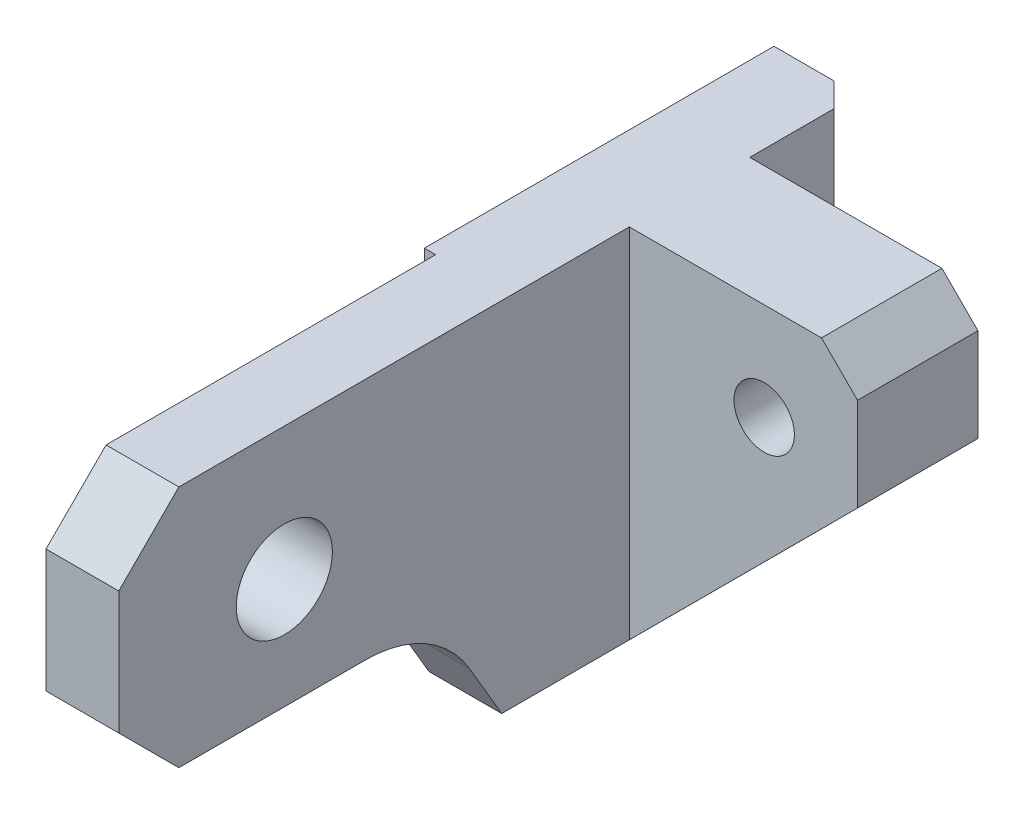
ISO-10303-21;
HEADER;
FILE_DESCRIPTION(('STEP AP214'),'2;1');
FILE_NAME('part.step','',(''),(''),'','','');
FILE_SCHEMA(('AUTOMOTIVE_DESIGN { 1 0 10303 214 1 1 1 1 }'));
ENDSEC;
DATA;
#1=APPLICATION_CONTEXT('core data for automotive mechanical design processes');
#2=APPLICATION_PROTOCOL_DEFINITION('international standard','automotive_design',2000,#1);
#3=PRODUCT_CONTEXT('',#1,'mechanical');
#4=PRODUCT('Part','Part','',(#3));
#5=PRODUCT_RELATED_PRODUCT_CATEGORY('part','',(#4));
#6=PRODUCT_DEFINITION_FORMATION('','',#4);
#7=PRODUCT_DEFINITION_CONTEXT('part definition',#1,'design');
#8=PRODUCT_DEFINITION('design','',#6,#7);
#9=PRODUCT_DEFINITION_SHAPE('','',#8);
#10=(LENGTH_UNIT() NAMED_UNIT(*) SI_UNIT(.MILLI.,.METRE.));
#11=(NAMED_UNIT(*) PLANE_ANGLE_UNIT() SI_UNIT($,.RADIAN.));
#12=(NAMED_UNIT(*) SI_UNIT($,.STERADIAN.) SOLID_ANGLE_UNIT());
#13=UNCERTAINTY_MEASURE_WITH_UNIT(LENGTH_MEASURE(1.E-05),#10,'distance_accuracy_value','');
#14=(GEOMETRIC_REPRESENTATION_CONTEXT(3) GLOBAL_UNCERTAINTY_ASSIGNED_CONTEXT((#13)) GLOBAL_UNIT_ASSIGNED_CONTEXT((#10,
#11,#12)) REPRESENTATION_CONTEXT('',''));
#15=CARTESIAN_POINT('',(0.,0.,0.));
#16=DIRECTION('',(0.,0.,1.));
#17=DIRECTION('',(1.,0.,0.));
#18=AXIS2_PLACEMENT_3D('',#15,#16,#17);
#19=CARTESIAN_POINT('',(-7.,0.,-27.095667874101));
#20=DIRECTION('',(0.,0.,-1.));
#21=DIRECTION('',(-1.,0.,0.));
#22=AXIS2_PLACEMENT_3D('',#19,#20,#21);
#23=PLANE('',#22);
#24=DIRECTION('',(1.,0.,0.));
#25=VECTOR('',#24,1.);
#26=CARTESIAN_POINT('',(-7.,0.,-27.095667874101));
#27=LINE('',#26,#25);
#28=CARTESIAN_POINT('',(-7.,0.,-27.095667874101));
#29=VERTEX_POINT('',#28);
#30=CARTESIAN_POINT('',(-2.00000000000001,0.,-27.095667874101));
#31=VERTEX_POINT('',#30);
#32=EDGE_CURVE('E256',#29,#31,#27,.T.);
#33=ORIENTED_EDGE('',*,*,#32,.T.);
#34=DIRECTION('',(0.,-1.,0.));
#35=VECTOR('',#34,1.);
#36=CARTESIAN_POINT('',(-2.00000000000001,0.,-27.095667874101));
#37=LINE('',#36,#35);
#38=CARTESIAN_POINT('',(-2.00000000000001,-29.7758607505091,-27.095667874101));
#39=VERTEX_POINT('',#38);
#40=EDGE_CURVE('E39',#31,#39,#37,.T.);
#41=ORIENTED_EDGE('',*,*,#40,.T.);
#42=DIRECTION('',(1.,0.,0.));
#43=VECTOR('',#42,1.);
#44=CARTESIAN_POINT('',(-7.,-29.7758607505091,-27.095667874101));
#45=LINE('',#44,#43);
#46=CARTESIAN_POINT('',(-7.,-29.7758607505091,-27.095667874101));
#47=VERTEX_POINT('',#46);
#48=EDGE_CURVE('E255',#47,#39,#45,.T.);
#49=ORIENTED_EDGE('',*,*,#48,.F.);
#50=DIRECTION('',(0.,1.,0.));
#51=VECTOR('',#50,1.);
#52=CARTESIAN_POINT('',(-7.,0.,-27.095667874101));
#53=LINE('',#52,#51);
#54=EDGE_CURVE('E263',#47,#29,#53,.T.);
#55=ORIENTED_EDGE('',*,*,#54,.T.);
#56=EDGE_LOOP('',(#33,#41,#49,#55));
#57=FACE_BOUND('',#56,.T.);
#58=ADVANCED_FACE('F31',(#57),#23,.T.);
#59=CARTESIAN_POINT('',(-7.,-29.7758607505091,2.56846046212789));
#60=DIRECTION('',(0.,-1.,0.));
#61=DIRECTION('',(0.,0.,-1.));
#62=AXIS2_PLACEMENT_3D('',#59,#60,#61);
#63=PLANE('',#62);
#64=ORIENTED_EDGE('',*,*,#48,.T.);
#65=DIRECTION('',(-0.707106781186549,0.,-0.707106781186546));
#66=VECTOR('',#65,1.);
#67=CARTESIAN_POINT('',(10.3320641681144,-29.7758607505091,-14.7636037059866));
#68=LINE('',#67,#66);
#69=CARTESIAN_POINT('',(0.,-29.7758607505091,-25.095667874101));
#70=VERTEX_POINT('',#69);
#71=EDGE_CURVE('E11',#39,#70,#68,.F.);
#72=ORIENTED_EDGE('',*,*,#71,.T.);
#73=DIRECTION('',(0.,0.,-1.));
#74=VECTOR('',#73,1.);
#75=CARTESIAN_POINT('',(0.,-29.7758607505091,2.56846046212789));
#76=LINE('',#75,#74);
#77=CARTESIAN_POINT('',(0.,-29.7758607505091,2.56846046212789));
#78=VERTEX_POINT('',#77);
#79=EDGE_CURVE('E261',#78,#70,#76,.T.);
#80=ORIENTED_EDGE('',*,*,#79,.F.);
#81=DIRECTION('',(1.,0.,0.));
#82=VECTOR('',#81,1.);
#83=CARTESIAN_POINT('',(-7.,-29.7758607505091,2.56846046212789));
#84=LINE('',#83,#82);
#85=CARTESIAN_POINT('',(-6.06043347951323,-29.7758607505091,2.56846046212789));
#86=VERTEX_POINT('',#85);
#87=EDGE_CURVE('E258',#86,#78,#84,.T.);
#88=ORIENTED_EDGE('',*,*,#87,.F.);
#89=DIRECTION('',(0.,0.,-1.));
#90=VECTOR('',#89,1.);
#91=CARTESIAN_POINT('',(-6.06043347951323,-29.7758607505091,2.01588114066453));
#92=LINE('',#91,#90);
#93=CARTESIAN_POINT('',(-6.06043347951323,-29.7758607505091,2.01588114066453));
#94=VERTEX_POINT('',#93);
#95=EDGE_CURVE('E317',#86,#94,#92,.T.);
#96=ORIENTED_EDGE('',*,*,#95,.T.);
#97=DIRECTION('',(-1.,0.,0.));
#98=VECTOR('',#97,1.);
#99=CARTESIAN_POINT('',(-9.31505151955418,-29.7758607505091,2.01588114066453));
#100=LINE('',#99,#98);
#101=CARTESIAN_POINT('',(-7.,-29.7758607505091,2.01588114066453));
#102=VERTEX_POINT('',#101);
#103=EDGE_CURVE('E308',#94,#102,#100,.T.);
#104=ORIENTED_EDGE('',*,*,#103,.T.);
#105=DIRECTION('',(0.,0.,-1.));
#106=VECTOR('',#105,1.);
#107=CARTESIAN_POINT('',(-7.,-29.7758607505091,2.56846046212789));
#108=LINE('',#107,#106);
#109=EDGE_CURVE('E217',#102,#47,#108,.T.);
#110=ORIENTED_EDGE('',*,*,#109,.T.);
#111=EDGE_LOOP('',(#64,#72,#80,#88,#96,#104,#110));
#112=FACE_BOUND('',#111,.T.);
#113=ADVANCED_FACE('F304',(#112),#63,.T.);
#114=CARTESIAN_POINT('',(-7.,-29.7758607505091,2.56846046212789));
#115=DIRECTION('',(0.,-0.505917133334447,0.862582085484422));
#116=DIRECTION('',(0.,-0.862582085484422,-0.505917133334448));
#117=AXIS2_PLACEMENT_3D('',#114,#115,#116);
#118=PLANE('',#117);
#119=DIRECTION('',(0.,0.862582085484422,0.505917133334448));
#120=VECTOR('',#119,1.);
#121=CARTESIAN_POINT('',(-6.06043347951323,-29.7758607505091,2.56846046212789));
#122=LINE('',#121,#120);
#123=CARTESIAN_POINT('',(-6.06043347951323,-25.1833019148258,5.26206405060706));
#124=VERTEX_POINT('',#123);
#125=EDGE_CURVE('E223',#86,#124,#122,.T.);
#126=ORIENTED_EDGE('',*,*,#125,.F.);
#127=ORIENTED_EDGE('',*,*,#87,.T.);
#128=DIRECTION('',(0.,-0.862582085484422,-0.505917133334447));
#129=VECTOR('',#128,1.);
#130=CARTESIAN_POINT('',(0.,-29.7758607505091,2.56846046212789));
#131=LINE('',#130,#129);
#132=CARTESIAN_POINT('',(0.,-25.1833019148258,5.26206405060707));
#133=VERTEX_POINT('',#132);
#134=EDGE_CURVE('E264',#133,#78,#131,.T.);
#135=ORIENTED_EDGE('',*,*,#134,.F.);
#136=DIRECTION('',(1.,0.,0.));
#137=VECTOR('',#136,1.);
#138=CARTESIAN_POINT('',(-7.,-25.1833019148258,5.26206405060707));
#139=LINE('',#138,#137);
#140=EDGE_CURVE('E250',#133,#124,#139,.F.);
#141=ORIENTED_EDGE('',*,*,#140,.T.);
#142=EDGE_LOOP('',(#126,#127,#135,#141));
#143=FACE_BOUND('',#142,.T.);
#144=ADVANCED_FACE('F339',(#143),#118,.T.);
#145=CARTESIAN_POINT('',(-7.,-20.2424732481703,8.1599330388405));
#146=DIRECTION('',(0.,-1.,0.));
#147=DIRECTION('',(0.,0.,-1.));
#148=AXIS2_PLACEMENT_3D('',#145,#146,#147);
#149=PLANE('',#148);
#150=DIRECTION('',(0.,0.,1.));
#151=VECTOR('',#150,1.);
#152=CARTESIAN_POINT('',(-6.06043347951323,-20.2424732481703,8.1599330388405));
#153=LINE('',#152,#151);
#154=CARTESIAN_POINT('',(-6.06043347951323,-20.2424732481703,13.8878849054513));
#155=VERTEX_POINT('',#154);
#156=CARTESIAN_POINT('',(-6.06043347951323,-20.2424732481703,29.4478632633648));
#157=VERTEX_POINT('',#156);
#158=EDGE_CURVE('E287',#155,#157,#153,.T.);
#159=ORIENTED_EDGE('',*,*,#158,.F.);
#160=DIRECTION('',(1.,0.,0.));
#161=VECTOR('',#160,1.);
#162=CARTESIAN_POINT('',(0.,-20.2424732481703,13.8878849054513));
#163=LINE('',#162,#161);
#164=CARTESIAN_POINT('',(0.,-20.2424732481703,13.8878849054513));
#165=VERTEX_POINT('',#164);
#166=EDGE_CURVE('E253',#155,#165,#163,.T.);
#167=ORIENTED_EDGE('',*,*,#166,.T.);
#168=DIRECTION('',(0.,0.,-1.));
#169=VECTOR('',#168,1.);
#170=CARTESIAN_POINT('',(0.,-20.2424732481703,8.1599330388405));
#171=LINE('',#170,#169);
#172=CARTESIAN_POINT('',(0.,-20.2424732481703,29.4478632633648));
#173=VERTEX_POINT('',#172);
#174=EDGE_CURVE('E266',#173,#165,#171,.T.);
#175=ORIENTED_EDGE('',*,*,#174,.F.);
#176=DIRECTION('',(-1.,0.,0.));
#177=VECTOR('',#176,1.);
#178=CARTESIAN_POINT('',(-7.,-20.2424732481703,29.4478632633648));
#179=LINE('',#178,#177);
#180=EDGE_CURVE('E233',#173,#157,#179,.T.);
#181=ORIENTED_EDGE('',*,*,#180,.T.);
#182=EDGE_LOOP('',(#159,#167,#175,#181));
#183=FACE_BOUND('',#182,.T.);
#184=ADVANCED_FACE('F330',(#183),#149,.T.);
#185=CARTESIAN_POINT('',(-7.,0.,34.4478632633648));
#186=DIRECTION('',(0.,0.,1.));
#187=DIRECTION('',(1.,0.,0.));
#188=AXIS2_PLACEMENT_3D('',#185,#186,#187);
#189=PLANE('',#188);
#190=DIRECTION('',(0.,1.,0.));
#191=VECTOR('',#190,1.);
#192=CARTESIAN_POINT('',(-6.06043347951323,0.,34.4478632633648));
#193=LINE('',#192,#191);
#194=CARTESIAN_POINT('',(-6.06043347951323,-15.2424732481703,34.4478632633648));
#195=VERTEX_POINT('',#194);
#196=CARTESIAN_POINT('',(-6.06043347951323,-5.,34.4478632633648));
#197=VERTEX_POINT('',#196);
#198=EDGE_CURVE('E291',#195,#197,#193,.T.);
#199=ORIENTED_EDGE('',*,*,#198,.F.);
#200=DIRECTION('',(1.,0.,0.));
#201=VECTOR('',#200,1.);
#202=CARTESIAN_POINT('',(-7.,-15.2424732481703,34.4478632633648));
#203=LINE('',#202,#201);
#204=CARTESIAN_POINT('',(0.,-15.2424732481703,34.4478632633648));
#205=VERTEX_POINT('',#204);
#206=EDGE_CURVE('E239',#195,#205,#203,.T.);
#207=ORIENTED_EDGE('',*,*,#206,.T.);
#208=DIRECTION('',(0.,-1.,0.));
#209=VECTOR('',#208,1.);
#210=CARTESIAN_POINT('',(0.,0.,34.4478632633648));
#211=LINE('',#210,#209);
#212=CARTESIAN_POINT('',(0.,-5.,34.4478632633648));
#213=VERTEX_POINT('',#212);
#214=EDGE_CURVE('E211',#213,#205,#211,.T.);
#215=ORIENTED_EDGE('',*,*,#214,.F.);
#216=DIRECTION('',(-1.,0.,0.));
#217=VECTOR('',#216,1.);
#218=CARTESIAN_POINT('',(-7.,-5.,34.4478632633648));
#219=LINE('',#218,#217);
#220=EDGE_CURVE('E236',#213,#197,#219,.T.);
#221=ORIENTED_EDGE('',*,*,#220,.T.);
#222=EDGE_LOOP('',(#199,#207,#215,#221));
#223=FACE_BOUND('',#222,.T.);
#224=ADVANCED_FACE('F277',(#223),#189,.T.);
#225=CARTESIAN_POINT('',(-7.,0.,-27.095667874101));
#226=DIRECTION('',(0.,1.,0.));
#227=DIRECTION('',(0.,0.,1.));
#228=AXIS2_PLACEMENT_3D('',#225,#226,#227);
#229=PLANE('',#228);
#230=DIRECTION('',(0.,0.,1.));
#231=VECTOR('',#230,1.);
#232=CARTESIAN_POINT('',(0.,0.,-27.095667874101));
#233=LINE('',#232,#231);
#234=CARTESIAN_POINT('',(0.,0.,-25.095667874101));
#235=VERTEX_POINT('',#234);
#236=CARTESIAN_POINT('',(0.,0.,-18.0789126569846));
#237=VERTEX_POINT('',#236);
#238=EDGE_CURVE('E208',#235,#237,#233,.T.);
#239=ORIENTED_EDGE('',*,*,#238,.F.);
#240=DIRECTION('',(0.707106781186549,0.,0.707106781186546));
#241=VECTOR('',#240,1.);
#242=CARTESIAN_POINT('',(-4.50000000000001,0.,-29.595667874101));
#243=LINE('',#242,#241);
#244=EDGE_CURVE('E53',#235,#31,#243,.F.);
#245=ORIENTED_EDGE('',*,*,#244,.T.);
#246=ORIENTED_EDGE('',*,*,#32,.F.);
#247=DIRECTION('',(0.,0.,1.));
#248=VECTOR('',#247,1.);
#249=CARTESIAN_POINT('',(-7.,0.,-27.095667874101));
#250=LINE('',#249,#248);
#251=CARTESIAN_POINT('',(-7.,0.,2.01588114066453));
#252=VERTEX_POINT('',#251);
#253=EDGE_CURVE('E297',#29,#252,#250,.T.);
#254=ORIENTED_EDGE('',*,*,#253,.T.);
#255=DIRECTION('',(-1.,0.,0.));
#256=VECTOR('',#255,1.);
#257=CARTESIAN_POINT('',(-9.31505151955418,0.,2.01588114066453));
#258=LINE('',#257,#256);
#259=CARTESIAN_POINT('',(-6.06043347951323,0.,2.01588114066453));
#260=VERTEX_POINT('',#259);
#261=EDGE_CURVE('E315',#260,#252,#258,.T.);
#262=ORIENTED_EDGE('',*,*,#261,.F.);
#263=DIRECTION('',(0.,0.,-1.));
#264=VECTOR('',#263,1.);
#265=CARTESIAN_POINT('',(-6.06043347951323,0.,2.01588114066453));
#266=LINE('',#265,#264);
#267=CARTESIAN_POINT('',(-6.06043347951323,0.,29.4478632633648));
#268=VERTEX_POINT('',#267);
#269=EDGE_CURVE('E227',#268,#260,#266,.T.);
#270=ORIENTED_EDGE('',*,*,#269,.F.);
#271=DIRECTION('',(1.,0.,0.));
#272=VECTOR('',#271,1.);
#273=CARTESIAN_POINT('',(-7.,0.,29.4478632633648));
#274=LINE('',#273,#272);
#275=CARTESIAN_POINT('',(0.,0.,29.4478632633648));
#276=VERTEX_POINT('',#275);
#277=EDGE_CURVE('E245',#268,#276,#274,.T.);
#278=ORIENTED_EDGE('',*,*,#277,.T.);
#279=CARTESIAN_POINT('',(0.,0.,-8.050225683217));
#280=VERTEX_POINT('',#279);
#281=EDGE_CURVE('E212',#280,#276,#233,.T.);
#282=ORIENTED_EDGE('',*,*,#281,.F.);
#283=DIRECTION('',(-1.,0.,0.));
#284=VECTOR('',#283,1.);
#285=CARTESIAN_POINT('',(19.,0.,-8.050225683217));
#286=LINE('',#285,#284);
#287=CARTESIAN_POINT('',(16.,0.,-8.050225683217));
#288=VERTEX_POINT('',#287);
#289=EDGE_CURVE('E170',#288,#280,#286,.T.);
#290=ORIENTED_EDGE('',*,*,#289,.F.);
#291=DIRECTION('',(0.,0.,-1.));
#292=VECTOR('',#291,1.);
#293=CARTESIAN_POINT('',(16.,0.,-27.095667874101));
#294=LINE('',#293,#292);
#295=CARTESIAN_POINT('',(16.,0.,-18.0789126569846));
#296=VERTEX_POINT('',#295);
#297=EDGE_CURVE('E199',#288,#296,#294,.T.);
#298=ORIENTED_EDGE('',*,*,#297,.T.);
#299=DIRECTION('',(-1.,0.,0.));
#300=VECTOR('',#299,1.);
#301=CARTESIAN_POINT('',(19.,0.,-18.0789126569846));
#302=LINE('',#301,#300);
#303=EDGE_CURVE('E186',#296,#237,#302,.T.);
#304=ORIENTED_EDGE('',*,*,#303,.T.);
#305=EDGE_LOOP('',(#239,#245,#246,#254,#262,#270,#278,#282,#290,#298,#304));
#306=FACE_BOUND('',#305,.T.);
#307=ADVANCED_FACE('F360',(#306),#229,.T.);
#308=CARTESIAN_POINT('',(-7.,-29.7758607505091,-27.095667874101));
#309=DIRECTION('',(1.,0.,0.));
#310=DIRECTION('',(0.,0.,-1.));
#311=AXIS2_PLACEMENT_3D('',#308,#309,#310);
#312=PLANE('',#311);
#313=ORIENTED_EDGE('',*,*,#109,.F.);
#314=DIRECTION('',(0.,1.,0.));
#315=VECTOR('',#314,1.);
#316=CARTESIAN_POINT('',(-7.,-29.7758607505091,2.01588114066453));
#317=LINE('',#316,#315);
#318=EDGE_CURVE('E228',#102,#252,#317,.T.);
#319=ORIENTED_EDGE('',*,*,#318,.T.);
#320=ORIENTED_EDGE('',*,*,#253,.F.);
#321=ORIENTED_EDGE('',*,*,#54,.F.);
#322=EDGE_LOOP('',(#313,#319,#320,#321));
#323=FACE_BOUND('',#322,.T.);
#324=ADVANCED_FACE('F311',(#323),#312,.F.);
#325=CARTESIAN_POINT('',(0.,-29.7758607505091,-27.095667874101));
#326=DIRECTION('',(1.,0.,0.));
#327=DIRECTION('',(0.,0.,-1.));
#328=AXIS2_PLACEMENT_3D('',#325,#326,#327);
#329=PLANE('',#328);
#330=ORIENTED_EDGE('',*,*,#79,.T.);
#331=DIRECTION('',(0.,1.,0.));
#332=VECTOR('',#331,1.);
#333=CARTESIAN_POINT('',(0.,-29.7758607505091,-25.095667874101));
#334=LINE('',#333,#332);
#335=EDGE_CURVE('E203',#70,#235,#334,.T.);
#336=ORIENTED_EDGE('',*,*,#335,.T.);
#337=ORIENTED_EDGE('',*,*,#238,.T.);
#338=DIRECTION('',(0.,1.,0.));
#339=VECTOR('',#338,1.);
#340=CARTESIAN_POINT('',(0.,-29.7711764912338,-18.0789126569846));
#341=LINE('',#340,#339);
#342=CARTESIAN_POINT('',(0.,-29.7711764912338,-18.0789126569846));
#343=VERTEX_POINT('',#342);
#344=EDGE_CURVE('E158',#343,#237,#341,.T.);
#345=ORIENTED_EDGE('',*,*,#344,.F.);
#346=DIRECTION('',(0.,0.,-1.));
#347=VECTOR('',#346,1.);
#348=CARTESIAN_POINT('',(0.,-29.7711764912338,-18.0789126569846));
#349=LINE('',#348,#347);
#350=CARTESIAN_POINT('',(0.,-29.7711764912338,-8.050225683217));
#351=VERTEX_POINT('',#350);
#352=EDGE_CURVE('E150',#351,#343,#349,.T.);
#353=ORIENTED_EDGE('',*,*,#352,.F.);
#354=DIRECTION('',(0.,-1.,0.));
#355=VECTOR('',#354,1.);
#356=CARTESIAN_POINT('',(0.,-29.7711764912338,-8.050225683217));
#357=LINE('',#356,#355);
#358=EDGE_CURVE('E155',#280,#351,#357,.T.);
#359=ORIENTED_EDGE('',*,*,#358,.F.);
#360=ORIENTED_EDGE('',*,*,#281,.T.);
#361=DIRECTION('',(0.,0.707106781186549,-0.707106781186546));
#362=VECTOR('',#361,1.);
#363=CARTESIAN_POINT('',(0.,13.3838351934783,16.0640280698866));
#364=LINE('',#363,#362);
#365=EDGE_CURVE('E241',#276,#213,#364,.F.);
#366=ORIENTED_EDGE('',*,*,#365,.T.);
#367=ORIENTED_EDGE('',*,*,#214,.T.);
#368=DIRECTION('',(0.,0.707106781186547,0.707106781186549));
#369=VECTOR('',#368,1.);
#370=CARTESIAN_POINT('',(0.,-53.2809325680726,-3.59059605653762));
#371=LINE('',#370,#369);
#372=EDGE_CURVE('E243',#205,#173,#371,.F.);
#373=ORIENTED_EDGE('',*,*,#372,.T.);
#374=ORIENTED_EDGE('',*,*,#174,.T.);
#375=CARTESIAN_POINT('',(0.,-30.2424732481703,13.8878849054513));
#376=DIRECTION('',(1.,0.,0.));
#377=DIRECTION('',(0.,0.,-1.));
#378=AXIS2_PLACEMENT_3D('',#375,#376,#377);
#379=CIRCLE('',#378,10.);
#380=EDGE_CURVE('E248',#165,#133,#379,.F.);
#381=ORIENTED_EDGE('',*,*,#380,.T.);
#382=ORIENTED_EDGE('',*,*,#134,.T.);
#383=EDGE_LOOP('',(#330,#336,#337,#345,#353,#359,#360,#366,#367,#373,#374,#381,#382));
#384=FACE_BOUND('',#383,.T.);
#385=CARTESIAN_POINT('',(0.,-11.0466777485737,20.6685006139612));
#386=DIRECTION('',(1.,0.,0.));
#387=DIRECTION('',(0.,0.,-1.));
#388=AXIS2_PLACEMENT_3D('',#385,#386,#387);
#389=CIRCLE('',#388,4.00000000042495);
#390=CARTESIAN_POINT('',(0.,-11.0466777485737,16.6685006135362));
#391=VERTEX_POINT('',#390);
#392=EDGE_CURVE('E198',#391,#391,#389,.T.);
#393=ORIENTED_EDGE('',*,*,#392,.F.);
#394=EDGE_LOOP('',(#393));
#395=FACE_BOUND('',#394,.T.);
#396=ADVANCED_FACE('F153',(#384,#395),#329,.T.);
#397=CARTESIAN_POINT('',(-7.,-30.2424732481703,13.8878849054513));
#398=DIRECTION('',(-1.,0.,0.));
#399=DIRECTION('',(0.,0.,1.));
#400=AXIS2_PLACEMENT_3D('',#397,#398,#399);
#401=CYLINDRICAL_SURFACE('',#400,10.);
#402=ORIENTED_EDGE('',*,*,#166,.F.);
#403=CARTESIAN_POINT('',(-6.06043347951323,-30.2424732481703,13.8878849054513));
#404=DIRECTION('',(1.,0.,0.));
#405=DIRECTION('',(0.,0.,-1.));
#406=AXIS2_PLACEMENT_3D('',#403,#404,#405);
#407=CIRCLE('',#406,10.);
#408=EDGE_CURVE('E286',#155,#124,#407,.F.);
#409=ORIENTED_EDGE('',*,*,#408,.T.);
#410=ORIENTED_EDGE('',*,*,#140,.F.);
#411=ORIENTED_EDGE('',*,*,#380,.F.);
#412=EDGE_LOOP('',(#402,#409,#410,#411));
#413=FACE_BOUND('',#412,.T.);
#414=ADVANCED_FACE('F333',(#413),#401,.F.);
#415=CARTESIAN_POINT('',(-7.,0.,29.4478632633648));
#416=DIRECTION('',(0.,-0.707106781186546,-0.707106781186549));
#417=DIRECTION('',(0.,0.707106781186549,-0.707106781186546));
#418=AXIS2_PLACEMENT_3D('',#415,#416,#417);
#419=PLANE('',#418);
#420=DIRECTION('',(0.,-0.707106781186549,0.707106781186546));
#421=VECTOR('',#420,1.);
#422=CARTESIAN_POINT('',(-6.06043347951323,0.,29.4478632633648));
#423=LINE('',#422,#421);
#424=EDGE_CURVE('E283',#197,#268,#423,.F.);
#425=ORIENTED_EDGE('',*,*,#424,.F.);
#426=ORIENTED_EDGE('',*,*,#220,.F.);
#427=ORIENTED_EDGE('',*,*,#365,.F.);
#428=ORIENTED_EDGE('',*,*,#277,.F.);
#429=EDGE_LOOP('',(#425,#426,#427,#428));
#430=FACE_BOUND('',#429,.T.);
#431=ADVANCED_FACE('F281',(#430),#419,.F.);
#432=CARTESIAN_POINT('',(-7.,-15.2424732481703,34.4478632633648));
#433=DIRECTION('',(0.,0.707106781186549,-0.707106781186547));
#434=DIRECTION('',(0.,0.707106781186547,0.707106781186549));
#435=AXIS2_PLACEMENT_3D('',#432,#433,#434);
#436=PLANE('',#435);
#437=DIRECTION('',(0.,-0.707106781186547,-0.707106781186549));
#438=VECTOR('',#437,1.);
#439=CARTESIAN_POINT('',(-6.06043347951323,-15.2424732481703,34.4478632633648));
#440=LINE('',#439,#438);
#441=EDGE_CURVE('E231',#157,#195,#440,.F.);
#442=ORIENTED_EDGE('',*,*,#441,.F.);
#443=ORIENTED_EDGE('',*,*,#180,.F.);
#444=ORIENTED_EDGE('',*,*,#372,.F.);
#445=ORIENTED_EDGE('',*,*,#206,.F.);
#446=EDGE_LOOP('',(#442,#443,#444,#445));
#447=FACE_BOUND('',#446,.T.);
#448=ADVANCED_FACE('F326',(#447),#436,.F.);
#449=CARTESIAN_POINT('',(-9.31505151955418,-29.7758607505091,2.01588114066453));
#450=DIRECTION('',(0.,0.,-1.));
#451=DIRECTION('',(-1.,0.,0.));
#452=AXIS2_PLACEMENT_3D('',#449,#450,#451);
#453=PLANE('',#452);
#454=ORIENTED_EDGE('',*,*,#103,.F.);
#455=DIRECTION('',(0.,1.,0.));
#456=VECTOR('',#455,1.);
#457=CARTESIAN_POINT('',(-6.06043347951323,-29.7758607505091,2.01588114066453));
#458=LINE('',#457,#456);
#459=EDGE_CURVE('E316',#94,#260,#458,.T.);
#460=ORIENTED_EDGE('',*,*,#459,.T.);
#461=ORIENTED_EDGE('',*,*,#261,.T.);
#462=ORIENTED_EDGE('',*,*,#318,.F.);
#463=EDGE_LOOP('',(#454,#460,#461,#462));
#464=FACE_BOUND('',#463,.T.);
#465=ADVANCED_FACE('F313',(#464),#453,.F.);
#466=CARTESIAN_POINT('',(-6.06043347951323,-29.7758607505091,2.01588114066453));
#467=DIRECTION('',(1.,0.,0.));
#468=DIRECTION('',(0.,0.,-1.));
#469=AXIS2_PLACEMENT_3D('',#466,#467,#468);
#470=PLANE('',#469);
#471=CARTESIAN_POINT('',(-6.06043347951323,-11.0466777485737,20.6685006139612));
#472=DIRECTION('',(1.,0.,0.));
#473=DIRECTION('',(0.,0.,-1.));
#474=AXIS2_PLACEMENT_3D('',#471,#472,#473);
#475=CIRCLE('',#474,4.00000000042495);
#476=CARTESIAN_POINT('',(-6.06043347951323,-11.0466777485737,16.6685006135362));
#477=VERTEX_POINT('',#476);
#478=EDGE_CURVE('E224',#477,#477,#475,.T.);
#479=ORIENTED_EDGE('',*,*,#478,.T.);
#480=EDGE_LOOP('',(#479));
#481=FACE_BOUND('',#480,.T.);
#482=ORIENTED_EDGE('',*,*,#125,.T.);
#483=ORIENTED_EDGE('',*,*,#408,.F.);
#484=ORIENTED_EDGE('',*,*,#158,.T.);
#485=ORIENTED_EDGE('',*,*,#441,.T.);
#486=ORIENTED_EDGE('',*,*,#198,.T.);
#487=ORIENTED_EDGE('',*,*,#424,.T.);
#488=ORIENTED_EDGE('',*,*,#269,.T.);
#489=ORIENTED_EDGE('',*,*,#459,.F.);
#490=ORIENTED_EDGE('',*,*,#95,.F.);
#491=EDGE_LOOP('',(#482,#483,#484,#485,#486,#487,#488,#489,#490));
#492=FACE_BOUND('',#491,.T.);
#493=ADVANCED_FACE('F323',(#481,#492),#470,.F.);
#494=CARTESIAN_POINT('',(-7.,-11.0466777485737,20.6685006139612));
#495=DIRECTION('',(1.,0.,0.));
#496=DIRECTION('',(0.,0.,-1.));
#497=AXIS2_PLACEMENT_3D('',#494,#495,#496);
#498=CYLINDRICAL_SURFACE('',#497,4.00000000042495);
#499=ORIENTED_EDGE('',*,*,#392,.T.);
#500=EDGE_LOOP('',(#499));
#501=FACE_BOUND('',#500,.T.);
#502=ORIENTED_EDGE('',*,*,#478,.F.);
#503=EDGE_LOOP('',(#502));
#504=FACE_BOUND('',#503,.T.);
#505=ADVANCED_FACE('F391',(#501,#504),#498,.F.);
#506=CARTESIAN_POINT('',(19.,-29.7711764912338,-18.0789126569846));
#507=DIRECTION('',(0.,0.,1.));
#508=DIRECTION('',(1.,0.,0.));
#509=AXIS2_PLACEMENT_3D('',#506,#507,#508);
#510=PLANE('',#509);
#511=CARTESIAN_POINT('',(11.2293412628942,-8.11804212236896,-18.0789126569846));
#512=DIRECTION('',(0.,0.,-1.));
#513=DIRECTION('',(-1.,0.,0.));
#514=AXIS2_PLACEMENT_3D('',#511,#512,#513);
#515=CIRCLE('',#514,2.51423532740732);
#516=CARTESIAN_POINT('',(8.71510593548689,-8.11804212236896,-18.0789126569846));
#517=VERTEX_POINT('',#516);
#518=EDGE_CURVE('E207',#517,#517,#515,.T.);
#519=ORIENTED_EDGE('',*,*,#518,.F.);
#520=EDGE_LOOP('',(#519));
#521=FACE_BOUND('',#520,.T.);
#522=ORIENTED_EDGE('',*,*,#303,.F.);
#523=DIRECTION('',(-0.707106781186549,0.707106781186546,0.));
#524=VECTOR('',#523,1.);
#525=CARTESIAN_POINT('',(19.,-3.,-18.0789126569846));
#526=LINE('',#525,#524);
#527=CARTESIAN_POINT('',(19.,-3.,-18.0789126569846));
#528=VERTEX_POINT('',#527);
#529=EDGE_CURVE('E201',#296,#528,#526,.F.);
#530=ORIENTED_EDGE('',*,*,#529,.T.);
#531=DIRECTION('',(0.,1.,0.));
#532=VECTOR('',#531,1.);
#533=CARTESIAN_POINT('',(19.,-29.7711764912338,-18.0789126569846));
#534=LINE('',#533,#532);
#535=CARTESIAN_POINT('',(19.,-10.7711764912338,-18.0789126569846));
#536=VERTEX_POINT('',#535);
#537=EDGE_CURVE('E161',#536,#528,#534,.T.);
#538=ORIENTED_EDGE('',*,*,#537,.F.);
#539=DIRECTION('',(-0.707106781186549,-0.707106781186546,0.));
#540=VECTOR('',#539,1.);
#541=CARTESIAN_POINT('',(19.,-10.7711764912338,-18.0789126569846));
#542=LINE('',#541,#540);
#543=EDGE_CURVE('E176',#536,#343,#542,.T.);
#544=ORIENTED_EDGE('',*,*,#543,.T.);
#545=ORIENTED_EDGE('',*,*,#344,.T.);
#546=EDGE_LOOP('',(#522,#530,#538,#544,#545));
#547=FACE_BOUND('',#546,.T.);
#548=ADVANCED_FACE('F381',(#521,#547),#510,.F.);
#549=CARTESIAN_POINT('',(19.,-29.7711764912338,-8.050225683217));
#550=DIRECTION('',(0.,0.,-1.));
#551=DIRECTION('',(-1.,0.,0.));
#552=AXIS2_PLACEMENT_3D('',#549,#550,#551);
#553=PLANE('',#552);
#554=CARTESIAN_POINT('',(11.2293412628942,-8.11804212236896,-8.050225683217));
#555=DIRECTION('',(0.,0.,-1.));
#556=DIRECTION('',(-1.,0.,0.));
#557=AXIS2_PLACEMENT_3D('',#554,#555,#556);
#558=CIRCLE('',#557,2.51423532740732);
#559=CARTESIAN_POINT('',(8.71510593548689,-8.11804212236896,-8.050225683217));
#560=VERTEX_POINT('',#559);
#561=EDGE_CURVE('E204',#560,#560,#558,.T.);
#562=ORIENTED_EDGE('',*,*,#561,.T.);
#563=EDGE_LOOP('',(#562));
#564=FACE_BOUND('',#563,.T.);
#565=DIRECTION('',(0.,-1.,0.));
#566=VECTOR('',#565,1.);
#567=CARTESIAN_POINT('',(19.,-29.7711764912338,-8.050225683217));
#568=LINE('',#567,#566);
#569=CARTESIAN_POINT('',(19.,-3.,-8.050225683217));
#570=VERTEX_POINT('',#569);
#571=CARTESIAN_POINT('',(19.,-10.7711764912338,-8.050225683217));
#572=VERTEX_POINT('',#571);
#573=EDGE_CURVE('E187',#570,#572,#568,.T.);
#574=ORIENTED_EDGE('',*,*,#573,.F.);
#575=DIRECTION('',(0.707106781186549,-0.707106781186546,0.));
#576=VECTOR('',#575,1.);
#577=CARTESIAN_POINT('',(19.,-3.,-8.050225683217));
#578=LINE('',#577,#576);
#579=EDGE_CURVE('E179',#570,#288,#578,.F.);
#580=ORIENTED_EDGE('',*,*,#579,.T.);
#581=ORIENTED_EDGE('',*,*,#289,.T.);
#582=ORIENTED_EDGE('',*,*,#358,.T.);
#583=DIRECTION('',(0.707106781186549,0.707106781186546,0.));
#584=VECTOR('',#583,1.);
#585=CARTESIAN_POINT('',(19.,-10.7711764912338,-8.050225683217));
#586=LINE('',#585,#584);
#587=EDGE_CURVE('E167',#351,#572,#586,.T.);
#588=ORIENTED_EDGE('',*,*,#587,.T.);
#589=EDGE_LOOP('',(#574,#580,#581,#582,#588));
#590=FACE_BOUND('',#589,.T.);
#591=ADVANCED_FACE('F166',(#564,#590),#553,.F.);
#592=CARTESIAN_POINT('',(19.,0.,-18.0789126569846));
#593=DIRECTION('',(1.,0.,0.));
#594=DIRECTION('',(0.,0.,-1.));
#595=AXIS2_PLACEMENT_3D('',#592,#593,#594);
#596=PLANE('',#595);
#597=ORIENTED_EDGE('',*,*,#537,.T.);
#598=DIRECTION('',(0.,0.,1.));
#599=VECTOR('',#598,1.);
#600=CARTESIAN_POINT('',(19.,-3.,-18.0789126569846));
#601=LINE('',#600,#599);
#602=EDGE_CURVE('E175',#528,#570,#601,.T.);
#603=ORIENTED_EDGE('',*,*,#602,.T.);
#604=ORIENTED_EDGE('',*,*,#573,.T.);
#605=DIRECTION('',(0.,0.,-1.));
#606=VECTOR('',#605,1.);
#607=CARTESIAN_POINT('',(19.,-10.7711764912338,-18.0789126569846));
#608=LINE('',#607,#606);
#609=EDGE_CURVE('E174',#572,#536,#608,.T.);
#610=ORIENTED_EDGE('',*,*,#609,.T.);
#611=EDGE_LOOP('',(#597,#603,#604,#610));
#612=FACE_BOUND('',#611,.T.);
#613=ADVANCED_FACE('F369',(#612),#596,.T.);
#614=CARTESIAN_POINT('',(19.,-10.7711764912338,-18.0789126569846));
#615=DIRECTION('',(0.707106781186546,-0.707106781186549,0.));
#616=DIRECTION('',(0.707106781186549,0.707106781186546,0.));
#617=AXIS2_PLACEMENT_3D('',#614,#615,#616);
#618=PLANE('',#617);
#619=ORIENTED_EDGE('',*,*,#587,.F.);
#620=ORIENTED_EDGE('',*,*,#352,.T.);
#621=ORIENTED_EDGE('',*,*,#543,.F.);
#622=ORIENTED_EDGE('',*,*,#609,.F.);
#623=EDGE_LOOP('',(#619,#620,#621,#622));
#624=FACE_BOUND('',#623,.T.);
#625=ADVANCED_FACE('F172',(#624),#618,.T.);
#626=CARTESIAN_POINT('',(19.,-3.,-18.0789126569846));
#627=DIRECTION('',(-0.707106781186546,-0.707106781186549,0.));
#628=DIRECTION('',(0.707106781186549,-0.707106781186546,0.));
#629=AXIS2_PLACEMENT_3D('',#626,#627,#628);
#630=PLANE('',#629);
#631=ORIENTED_EDGE('',*,*,#529,.F.);
#632=ORIENTED_EDGE('',*,*,#297,.F.);
#633=ORIENTED_EDGE('',*,*,#579,.F.);
#634=ORIENTED_EDGE('',*,*,#602,.F.);
#635=EDGE_LOOP('',(#631,#632,#633,#634));
#636=FACE_BOUND('',#635,.T.);
#637=ADVANCED_FACE('F349',(#636),#630,.F.);
#638=CARTESIAN_POINT('',(11.2293412628942,-8.11804212236896,34.4478632633648));
#639=DIRECTION('',(0.,0.,-1.));
#640=DIRECTION('',(-1.,0.,0.));
#641=AXIS2_PLACEMENT_3D('',#638,#639,#640);
#642=CYLINDRICAL_SURFACE('',#641,2.51423532740732);
#643=ORIENTED_EDGE('',*,*,#518,.T.);
#644=EDGE_LOOP('',(#643));
#645=FACE_BOUND('',#644,.T.);
#646=ORIENTED_EDGE('',*,*,#561,.F.);
#647=EDGE_LOOP('',(#646));
#648=FACE_BOUND('',#647,.T.);
#649=ADVANCED_FACE('F345',(#645,#648),#642,.F.);
#650=CARTESIAN_POINT('',(0.,-29.7758607505091,-25.095667874101));
#651=DIRECTION('',(-0.707106781186546,0.,0.707106781186549));
#652=DIRECTION('',(0.707106781186549,0.,0.707106781186546));
#653=AXIS2_PLACEMENT_3D('',#650,#651,#652);
#654=PLANE('',#653);
#655=ORIENTED_EDGE('',*,*,#71,.F.);
#656=ORIENTED_EDGE('',*,*,#40,.F.);
#657=ORIENTED_EDGE('',*,*,#244,.F.);
#658=ORIENTED_EDGE('',*,*,#335,.F.);
#659=EDGE_LOOP('',(#655,#656,#657,#658));
#660=FACE_BOUND('',#659,.T.);
#661=ADVANCED_FACE('F33',(#660),#654,.F.);
#662=CLOSED_SHELL('',(#58,#113,#144,#184,#224,#307,#324,#396,#414,#431,#448,#465,#493,#505,#548,
#591,#613,#625,#637,#649,#661));
#663=MANIFOLD_SOLID_BREP('B2',#662);
#664=ADVANCED_BREP_SHAPE_REPRESENTATION('',(#18,#663),#14);
#665=SHAPE_DEFINITION_REPRESENTATION(#9,#664);
ENDSEC;
END-ISO-10303-21;
